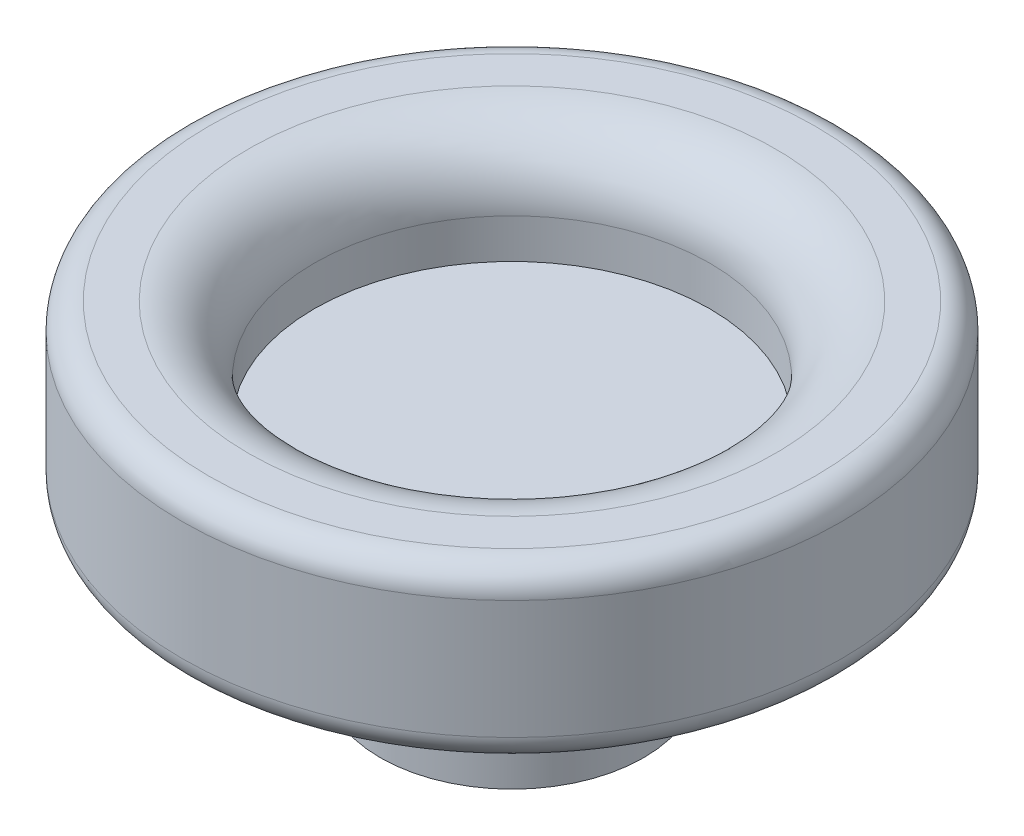
ISO-10303-21;
HEADER;
FILE_DESCRIPTION(('STEP AP214'),'2;1');
FILE_NAME('part.step','',(''),(''),'','','');
FILE_SCHEMA(('AUTOMOTIVE_DESIGN { 1 0 10303 214 1 1 1 1 }'));
ENDSEC;
DATA;
#1=APPLICATION_CONTEXT('core data for automotive mechanical design processes');
#2=APPLICATION_PROTOCOL_DEFINITION('international standard','automotive_design',2000,#1);
#3=PRODUCT_CONTEXT('',#1,'mechanical');
#4=PRODUCT('Part','Part','',(#3));
#5=PRODUCT_RELATED_PRODUCT_CATEGORY('part','',(#4));
#6=PRODUCT_DEFINITION_FORMATION('','',#4);
#7=PRODUCT_DEFINITION_CONTEXT('part definition',#1,'design');
#8=PRODUCT_DEFINITION('design','',#6,#7);
#9=PRODUCT_DEFINITION_SHAPE('','',#8);
#10=(LENGTH_UNIT() NAMED_UNIT(*) SI_UNIT(.MILLI.,.METRE.));
#11=(NAMED_UNIT(*) PLANE_ANGLE_UNIT() SI_UNIT($,.RADIAN.));
#12=(NAMED_UNIT(*) SI_UNIT($,.STERADIAN.) SOLID_ANGLE_UNIT());
#13=UNCERTAINTY_MEASURE_WITH_UNIT(LENGTH_MEASURE(1.E-05),#10,'distance_accuracy_value','');
#14=(GEOMETRIC_REPRESENTATION_CONTEXT(3) GLOBAL_UNCERTAINTY_ASSIGNED_CONTEXT((#13)) GLOBAL_UNIT_ASSIGNED_CONTEXT((#10,
#11,#12)) REPRESENTATION_CONTEXT('',''));
#15=CARTESIAN_POINT('',(0.,0.,0.));
#16=DIRECTION('',(0.,0.,1.));
#17=DIRECTION('',(1.,0.,0.));
#18=AXIS2_PLACEMENT_3D('',#15,#16,#17);
#19=CARTESIAN_POINT('',(0.,12.,0.));
#20=DIRECTION('',(0.,1.,0.));
#21=DIRECTION('',(0.,0.,1.));
#22=AXIS2_PLACEMENT_3D('',#19,#20,#21);
#23=CYLINDRICAL_SURFACE('',#22,25.);
#24=CARTESIAN_POINT('',(0.,14.,0.));
#25=DIRECTION('',(0.,1.,0.));
#26=DIRECTION('',(0.,0.,1.));
#27=AXIS2_PLACEMENT_3D('',#24,#25,#26);
#28=CIRCLE('',#27,25.);
#29=CARTESIAN_POINT('',(0.,14.,25.));
#30=VERTEX_POINT('',#29);
#31=EDGE_CURVE('E63',#30,#30,#28,.T.);
#32=ORIENTED_EDGE('',*,*,#31,.T.);
#33=EDGE_LOOP('',(#32));
#34=FACE_BOUND('',#33,.T.);
#35=CARTESIAN_POINT('',(0.,23.,0.));
#36=DIRECTION('',(0.,1.,0.));
#37=DIRECTION('',(0.,0.,1.));
#38=AXIS2_PLACEMENT_3D('',#35,#36,#37);
#39=CIRCLE('',#38,25.);
#40=CARTESIAN_POINT('',(0.,23.,25.));
#41=VERTEX_POINT('',#40);
#42=EDGE_CURVE('E66',#41,#41,#39,.F.);
#43=ORIENTED_EDGE('',*,*,#42,.T.);
#44=EDGE_LOOP('',(#43));
#45=FACE_BOUND('',#44,.T.);
#46=ADVANCED_FACE('F43',(#34,#45),#23,.T.);
#47=CARTESIAN_POINT('',(0.,12.,0.));
#48=DIRECTION('',(0.,1.,0.));
#49=DIRECTION('',(0.,0.,1.));
#50=AXIS2_PLACEMENT_3D('',#47,#48,#49);
#51=PLANE('',#50);
#52=CARTESIAN_POINT('',(0.,12.,0.));
#53=DIRECTION('',(0.,1.,0.));
#54=DIRECTION('',(0.,0.,1.));
#55=AXIS2_PLACEMENT_3D('',#52,#53,#54);
#56=CIRCLE('',#55,23.);
#57=CARTESIAN_POINT('',(0.,12.,23.));
#58=VERTEX_POINT('',#57);
#59=EDGE_CURVE('E58',#58,#58,#56,.F.);
#60=ORIENTED_EDGE('',*,*,#59,.T.);
#61=EDGE_LOOP('',(#60));
#62=FACE_BOUND('',#61,.T.);
#63=CARTESIAN_POINT('',(0.,12.,0.));
#64=DIRECTION('',(0.,1.,0.));
#65=DIRECTION('',(0.,0.,1.));
#66=AXIS2_PLACEMENT_3D('',#63,#64,#65);
#67=CIRCLE('',#66,10.);
#68=CARTESIAN_POINT('',(0.,12.,10.));
#69=VERTEX_POINT('',#68);
#70=EDGE_CURVE('E69',#69,#69,#67,.T.);
#71=ORIENTED_EDGE('',*,*,#70,.T.);
#72=EDGE_LOOP('',(#71));
#73=FACE_BOUND('',#72,.T.);
#74=ADVANCED_FACE('F100',(#62,#73),#51,.F.);
#75=CARTESIAN_POINT('',(0.,25.,0.));
#76=DIRECTION('',(0.,1.,0.));
#77=DIRECTION('',(0.,0.,1.));
#78=AXIS2_PLACEMENT_3D('',#75,#76,#77);
#79=PLANE('',#78);
#80=CARTESIAN_POINT('',(0.,25.,0.));
#81=DIRECTION('',(0.,1.,0.));
#82=DIRECTION('',(0.,0.,1.));
#83=AXIS2_PLACEMENT_3D('',#80,#81,#82);
#84=CIRCLE('',#83,20.);
#85=CARTESIAN_POINT('',(0.,25.,20.));
#86=VERTEX_POINT('',#85);
#87=EDGE_CURVE('E12',#86,#86,#84,.F.);
#88=ORIENTED_EDGE('',*,*,#87,.T.);
#89=EDGE_LOOP('',(#88));
#90=FACE_BOUND('',#89,.T.);
#91=CARTESIAN_POINT('',(0.,25.,0.));
#92=DIRECTION('',(0.,1.,0.));
#93=DIRECTION('',(0.,0.,1.));
#94=AXIS2_PLACEMENT_3D('',#91,#92,#93);
#95=CIRCLE('',#94,23.);
#96=CARTESIAN_POINT('',(0.,25.,23.));
#97=VERTEX_POINT('',#96);
#98=EDGE_CURVE('E54',#97,#97,#95,.T.);
#99=ORIENTED_EDGE('',*,*,#98,.T.);
#100=EDGE_LOOP('',(#99));
#101=FACE_BOUND('',#100,.T.);
#102=ADVANCED_FACE('F106',(#90,#101),#79,.T.);
#103=CARTESIAN_POINT('',(0.,15.,0.));
#104=DIRECTION('',(0.,-1.,0.));
#105=DIRECTION('',(0.,0.,-1.));
#106=AXIS2_PLACEMENT_3D('',#103,#104,#105);
#107=CYLINDRICAL_SURFACE('',#106,10.);
#108=CARTESIAN_POINT('',(0.,0.,0.));
#109=DIRECTION('',(0.,1.,0.));
#110=DIRECTION('',(0.,0.,1.));
#111=AXIS2_PLACEMENT_3D('',#108,#109,#110);
#112=CIRCLE('',#111,10.);
#113=CARTESIAN_POINT('',(0.,0.,10.));
#114=VERTEX_POINT('',#113);
#115=EDGE_CURVE('E75',#114,#114,#112,.T.);
#116=ORIENTED_EDGE('',*,*,#115,.T.);
#117=EDGE_LOOP('',(#116));
#118=FACE_BOUND('',#117,.T.);
#119=ORIENTED_EDGE('',*,*,#70,.F.);
#120=EDGE_LOOP('',(#119));
#121=FACE_BOUND('',#120,.T.);
#122=ADVANCED_FACE('F116',(#118,#121),#107,.T.);
#123=CARTESIAN_POINT('',(0.,15.,0.));
#124=DIRECTION('',(0.,-1.,0.));
#125=DIRECTION('',(0.,0.,-1.));
#126=AXIS2_PLACEMENT_3D('',#123,#124,#125);
#127=CYLINDRICAL_SURFACE('',#126,7.5);
#128=CARTESIAN_POINT('',(0.,0.,0.));
#129=DIRECTION('',(0.,1.,0.));
#130=DIRECTION('',(0.,0.,1.));
#131=AXIS2_PLACEMENT_3D('',#128,#129,#130);
#132=CIRCLE('',#131,7.5);
#133=CARTESIAN_POINT('',(0.,0.,7.5));
#134=VERTEX_POINT('',#133);
#135=EDGE_CURVE('E73',#134,#134,#132,.T.);
#136=ORIENTED_EDGE('',*,*,#135,.F.);
#137=EDGE_LOOP('',(#136));
#138=FACE_BOUND('',#137,.T.);
#139=CARTESIAN_POINT('',(0.,12.,0.));
#140=DIRECTION('',(0.,1.,0.));
#141=DIRECTION('',(0.,0.,1.));
#142=AXIS2_PLACEMENT_3D('',#139,#140,#141);
#143=CIRCLE('',#142,7.5);
#144=CARTESIAN_POINT('',(0.,12.,7.5));
#145=VERTEX_POINT('',#144);
#146=EDGE_CURVE('E70',#145,#145,#143,.T.);
#147=ORIENTED_EDGE('',*,*,#146,.T.);
#148=EDGE_LOOP('',(#147));
#149=FACE_BOUND('',#148,.T.);
#150=ADVANCED_FACE('F112',(#138,#149),#127,.F.);
#151=CARTESIAN_POINT('',(0.,0.,0.));
#152=DIRECTION('',(0.,1.,0.));
#153=DIRECTION('',(0.,0.,1.));
#154=AXIS2_PLACEMENT_3D('',#151,#152,#153);
#155=PLANE('',#154);
#156=ORIENTED_EDGE('',*,*,#115,.F.);
#157=EDGE_LOOP('',(#156));
#158=FACE_BOUND('',#157,.T.);
#159=ORIENTED_EDGE('',*,*,#135,.T.);
#160=EDGE_LOOP('',(#159));
#161=FACE_BOUND('',#160,.T.);
#162=ADVANCED_FACE('F115',(#158,#161),#155,.F.);
#163=ORIENTED_EDGE('',*,*,#146,.F.);
#164=EDGE_LOOP('',(#163));
#165=FACE_BOUND('',#164,.T.);
#166=ADVANCED_FACE('F109',(#165),#51,.F.);
#167=CARTESIAN_POINT('',(0.,14.,0.));
#168=DIRECTION('',(0.,1.,0.));
#169=DIRECTION('',(0.,0.,1.));
#170=AXIS2_PLACEMENT_3D('',#167,#168,#169);
#171=TOROIDAL_SURFACE('',#170,23.,2.);
#172=ORIENTED_EDGE('',*,*,#59,.F.);
#173=EDGE_LOOP('',(#172));
#174=FACE_BOUND('',#173,.T.);
#175=ORIENTED_EDGE('',*,*,#31,.F.);
#176=EDGE_LOOP('',(#175));
#177=FACE_BOUND('',#176,.T.);
#178=ADVANCED_FACE('F96',(#174,#177),#171,.T.);
#179=CARTESIAN_POINT('',(0.,23.,0.));
#180=DIRECTION('',(0.,1.,0.));
#181=DIRECTION('',(0.,0.,1.));
#182=AXIS2_PLACEMENT_3D('',#179,#180,#181);
#183=TOROIDAL_SURFACE('',#182,23.,2.);
#184=ORIENTED_EDGE('',*,*,#42,.F.);
#185=EDGE_LOOP('',(#184));
#186=FACE_BOUND('',#185,.T.);
#187=ORIENTED_EDGE('',*,*,#98,.F.);
#188=EDGE_LOOP('',(#187));
#189=FACE_BOUND('',#188,.T.);
#190=ADVANCED_FACE('F89',(#186,#189),#183,.T.);
#191=CARTESIAN_POINT('',(0.,17.,0.));
#192=DIRECTION('',(0.,1.,0.));
#193=DIRECTION('',(0.,0.,1.));
#194=AXIS2_PLACEMENT_3D('',#191,#192,#193);
#195=CYLINDRICAL_SURFACE('',#194,15.);
#196=CARTESIAN_POINT('',(0.,20.,0.));
#197=DIRECTION('',(0.,1.,0.));
#198=DIRECTION('',(0.,0.,1.));
#199=AXIS2_PLACEMENT_3D('',#196,#197,#198);
#200=CIRCLE('',#199,15.);
#201=CARTESIAN_POINT('',(0.,20.,15.));
#202=VERTEX_POINT('',#201);
#203=EDGE_CURVE('E50',#202,#202,#200,.T.);
#204=ORIENTED_EDGE('',*,*,#203,.T.);
#205=EDGE_LOOP('',(#204));
#206=FACE_BOUND('',#205,.T.);
#207=CARTESIAN_POINT('',(0.,17.,0.));
#208=DIRECTION('',(0.,1.,0.));
#209=DIRECTION('',(0.,0.,1.));
#210=AXIS2_PLACEMENT_3D('',#207,#208,#209);
#211=CIRCLE('',#210,15.);
#212=CARTESIAN_POINT('',(0.,17.,15.));
#213=VERTEX_POINT('',#212);
#214=EDGE_CURVE('E74',#213,#213,#211,.T.);
#215=ORIENTED_EDGE('',*,*,#214,.F.);
#216=EDGE_LOOP('',(#215));
#217=FACE_BOUND('',#216,.T.);
#218=ADVANCED_FACE('F87',(#206,#217),#195,.F.);
#219=CARTESIAN_POINT('',(0.,17.,0.));
#220=DIRECTION('',(0.,1.,0.));
#221=DIRECTION('',(0.,0.,1.));
#222=AXIS2_PLACEMENT_3D('',#219,#220,#221);
#223=PLANE('',#222);
#224=ORIENTED_EDGE('',*,*,#214,.T.);
#225=EDGE_LOOP('',(#224));
#226=FACE_BOUND('',#225,.T.);
#227=ADVANCED_FACE('F85',(#226),#223,.T.);
#228=CARTESIAN_POINT('',(0.,20.,0.));
#229=DIRECTION('',(0.,1.,0.));
#230=DIRECTION('',(0.,0.,1.));
#231=AXIS2_PLACEMENT_3D('',#228,#229,#230);
#232=TOROIDAL_SURFACE('',#231,20.,5.);
#233=ORIENTED_EDGE('',*,*,#87,.F.);
#234=EDGE_LOOP('',(#233));
#235=FACE_BOUND('',#234,.T.);
#236=ORIENTED_EDGE('',*,*,#203,.F.);
#237=EDGE_LOOP('',(#236));
#238=FACE_BOUND('',#237,.T.);
#239=ADVANCED_FACE('F45',(#235,#238),#232,.T.);
#240=CLOSED_SHELL('',(#46,#74,#102,#122,#150,#162,#166,#178,#190,#218,#227,#239));
#241=MANIFOLD_SOLID_BREP('B2',#240);
#242=ADVANCED_BREP_SHAPE_REPRESENTATION('',(#18,#241),#14);
#243=SHAPE_DEFINITION_REPRESENTATION(#9,#242);
ENDSEC;
END-ISO-10303-21;
